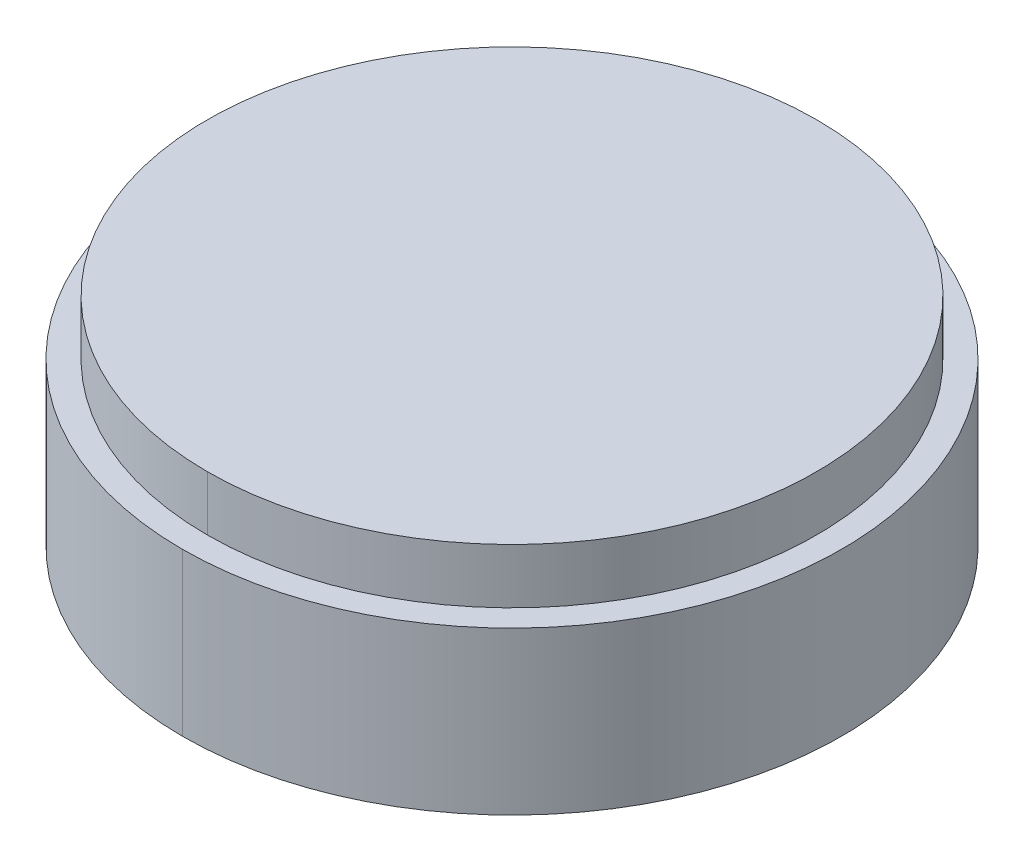
ISO-10303-21;
HEADER;
FILE_DESCRIPTION(('STEP AP214'),'2;1');
FILE_NAME('part.step','',(''),(''),'','','');
FILE_SCHEMA(('AUTOMOTIVE_DESIGN { 1 0 10303 214 1 1 1 1 }'));
ENDSEC;
DATA;
#1=APPLICATION_CONTEXT('core data for automotive mechanical design processes');
#2=APPLICATION_PROTOCOL_DEFINITION('international standard','automotive_design',2000,#1);
#3=PRODUCT_CONTEXT('',#1,'mechanical');
#4=PRODUCT('Part','Part','',(#3));
#5=PRODUCT_RELATED_PRODUCT_CATEGORY('part','',(#4));
#6=PRODUCT_DEFINITION_FORMATION('','',#4);
#7=PRODUCT_DEFINITION_CONTEXT('part definition',#1,'design');
#8=PRODUCT_DEFINITION('design','',#6,#7);
#9=PRODUCT_DEFINITION_SHAPE('','',#8);
#10=(LENGTH_UNIT() NAMED_UNIT(*) SI_UNIT(.MILLI.,.METRE.));
#11=(NAMED_UNIT(*) PLANE_ANGLE_UNIT() SI_UNIT($,.RADIAN.));
#12=(NAMED_UNIT(*) SI_UNIT($,.STERADIAN.) SOLID_ANGLE_UNIT());
#13=UNCERTAINTY_MEASURE_WITH_UNIT(LENGTH_MEASURE(1.E-05),#10,'distance_accuracy_value','');
#14=(GEOMETRIC_REPRESENTATION_CONTEXT(3) GLOBAL_UNCERTAINTY_ASSIGNED_CONTEXT((#13)) GLOBAL_UNIT_ASSIGNED_CONTEXT((#10,
#11,#12)) REPRESENTATION_CONTEXT('',''));
#15=CARTESIAN_POINT('',(0.,0.,0.));
#16=DIRECTION('',(0.,0.,1.));
#17=DIRECTION('',(1.,0.,0.));
#18=AXIS2_PLACEMENT_3D('',#15,#16,#17);
#19=CARTESIAN_POINT('',(0.,6.3,29.5));
#20=DIRECTION('',(0.,-1.,0.));
#21=DIRECTION('',(0.,0.,-1.));
#22=AXIS2_PLACEMENT_3D('',#19,#20,#21);
#23=CYLINDRICAL_SURFACE('',#22,1.5);
#24=CARTESIAN_POINT('',(0.,6.3,29.5));
#25=DIRECTION('',(0.,-1.,0.));
#26=DIRECTION('',(0.,0.,-1.));
#27=AXIS2_PLACEMENT_3D('',#24,#25,#26);
#28=CIRCLE('',#27,1.5);
#29=CARTESIAN_POINT('',(0.,6.3,31.));
#30=VERTEX_POINT('',#29);
#31=CARTESIAN_POINT('',(0.,6.3,28.));
#32=VERTEX_POINT('',#31);
#33=EDGE_CURVE('E39',#30,#32,#28,.T.);
#34=ORIENTED_EDGE('',*,*,#33,.F.);
#35=DIRECTION('',(0.,-1.,0.));
#36=VECTOR('',#35,1.);
#37=CARTESIAN_POINT('',(0.,6.3,31.));
#38=LINE('',#37,#36);
#39=CARTESIAN_POINT('',(0.,0.,31.));
#40=VERTEX_POINT('',#39);
#41=EDGE_CURVE('E10',#30,#40,#38,.T.);
#42=ORIENTED_EDGE('',*,*,#41,.T.);
#43=CARTESIAN_POINT('',(0.,0.,29.5));
#44=DIRECTION('',(0.,-1.,0.));
#45=DIRECTION('',(0.,0.,-1.));
#46=AXIS2_PLACEMENT_3D('',#43,#44,#45);
#47=CIRCLE('',#46,1.5);
#48=CARTESIAN_POINT('',(0.,0.,28.));
#49=VERTEX_POINT('',#48);
#50=EDGE_CURVE('E26',#40,#49,#47,.T.);
#51=ORIENTED_EDGE('',*,*,#50,.T.);
#52=DIRECTION('',(0.,-1.,0.));
#53=VECTOR('',#52,1.);
#54=CARTESIAN_POINT('',(0.,6.3,28.));
#55=LINE('',#54,#53);
#56=EDGE_CURVE('E156',#32,#49,#55,.T.);
#57=ORIENTED_EDGE('',*,*,#56,.F.);
#58=EDGE_LOOP('',(#34,#42,#51,#57));
#59=FACE_BOUND('',#58,.T.);
#60=ADVANCED_FACE('F15',(#59),#23,.F.);
#61=CARTESIAN_POINT('',(-20.8596500450019,6.3,-20.8596500450032));
#62=DIRECTION('',(0.,-1.,0.));
#63=DIRECTION('',(0.,0.,-1.));
#64=AXIS2_PLACEMENT_3D('',#61,#62,#63);
#65=CYLINDRICAL_SURFACE('',#64,1.50000000000062);
#66=CARTESIAN_POINT('',(-20.8596500450019,6.3,-20.8596500450032));
#67=DIRECTION('',(0.,-1.,0.));
#68=DIRECTION('',(0.,0.,-1.));
#69=AXIS2_PLACEMENT_3D('',#66,#67,#68);
#70=CIRCLE('',#69,1.50000000000062);
#71=CARTESIAN_POINT('',(-20.8596500450019,6.3,-19.3596500450025));
#72=VERTEX_POINT('',#71);
#73=CARTESIAN_POINT('',(-20.8596500450019,6.3,-22.3596500450038));
#74=VERTEX_POINT('',#73);
#75=EDGE_CURVE('E147',#72,#74,#70,.T.);
#76=ORIENTED_EDGE('',*,*,#75,.F.);
#77=DIRECTION('',(0.,-1.,0.));
#78=VECTOR('',#77,1.);
#79=CARTESIAN_POINT('',(-20.8596500450019,6.3,-19.3596500450025));
#80=LINE('',#79,#78);
#81=CARTESIAN_POINT('',(-20.8596500450019,0.,-19.3596500450025));
#82=VERTEX_POINT('',#81);
#83=EDGE_CURVE('E170',#72,#82,#80,.T.);
#84=ORIENTED_EDGE('',*,*,#83,.T.);
#85=CARTESIAN_POINT('',(-20.8596500450019,0.,-20.8596500450032));
#86=DIRECTION('',(0.,-1.,0.));
#87=DIRECTION('',(0.,0.,-1.));
#88=AXIS2_PLACEMENT_3D('',#85,#86,#87);
#89=CIRCLE('',#88,1.50000000000062);
#90=CARTESIAN_POINT('',(-20.8596500450019,0.,-22.3596500450038));
#91=VERTEX_POINT('',#90);
#92=EDGE_CURVE('E161',#82,#91,#89,.T.);
#93=ORIENTED_EDGE('',*,*,#92,.T.);
#94=DIRECTION('',(0.,-1.,0.));
#95=VECTOR('',#94,1.);
#96=CARTESIAN_POINT('',(-20.8596500450019,6.3,-22.3596500450038));
#97=LINE('',#96,#95);
#98=EDGE_CURVE('E159',#74,#91,#97,.T.);
#99=ORIENTED_EDGE('',*,*,#98,.F.);
#100=EDGE_LOOP('',(#76,#84,#93,#99));
#101=FACE_BOUND('',#100,.T.);
#102=ADVANCED_FACE('F160',(#101),#65,.F.);
#103=CARTESIAN_POINT('',(20.8596500450044,6.3,-20.8596500450019));
#104=DIRECTION('',(0.,-1.,0.));
#105=DIRECTION('',(0.,0.,-1.));
#106=AXIS2_PLACEMENT_3D('',#103,#104,#105);
#107=CYLINDRICAL_SURFACE('',#106,1.50000000000165);
#108=CARTESIAN_POINT('',(20.8596500450044,6.3,-20.8596500450019));
#109=DIRECTION('',(0.,-1.,0.));
#110=DIRECTION('',(0.,0.,-1.));
#111=AXIS2_PLACEMENT_3D('',#108,#109,#110);
#112=CIRCLE('',#111,1.50000000000165);
#113=CARTESIAN_POINT('',(20.8596500450044,6.3,-19.3596500450003));
#114=VERTEX_POINT('',#113);
#115=CARTESIAN_POINT('',(20.8596500450044,6.3,-22.3596500450036));
#116=VERTEX_POINT('',#115);
#117=EDGE_CURVE('E166',#114,#116,#112,.T.);
#118=ORIENTED_EDGE('',*,*,#117,.F.);
#119=DIRECTION('',(0.,-1.,0.));
#120=VECTOR('',#119,1.);
#121=CARTESIAN_POINT('',(20.8596500450044,6.3,-19.3596500450003));
#122=LINE('',#121,#120);
#123=CARTESIAN_POINT('',(20.8596500450044,0.,-19.3596500450003));
#124=VERTEX_POINT('',#123);
#125=EDGE_CURVE('E200',#114,#124,#122,.T.);
#126=ORIENTED_EDGE('',*,*,#125,.T.);
#127=CARTESIAN_POINT('',(20.8596500450044,0.,-20.8596500450019));
#128=DIRECTION('',(0.,-1.,0.));
#129=DIRECTION('',(0.,0.,-1.));
#130=AXIS2_PLACEMENT_3D('',#127,#128,#129);
#131=CIRCLE('',#130,1.50000000000165);
#132=CARTESIAN_POINT('',(20.8596500450044,0.,-22.3596500450036));
#133=VERTEX_POINT('',#132);
#134=EDGE_CURVE('E204',#124,#133,#131,.T.);
#135=ORIENTED_EDGE('',*,*,#134,.T.);
#136=DIRECTION('',(0.,-1.,0.));
#137=VECTOR('',#136,1.);
#138=CARTESIAN_POINT('',(20.8596500450044,6.3,-22.3596500450036));
#139=LINE('',#138,#137);
#140=EDGE_CURVE('E191',#116,#133,#139,.T.);
#141=ORIENTED_EDGE('',*,*,#140,.F.);
#142=EDGE_LOOP('',(#118,#126,#135,#141));
#143=FACE_BOUND('',#142,.T.);
#144=ADVANCED_FACE('F360',(#143),#107,.F.);
#145=CARTESIAN_POINT('',(20.8596500450031,6.3,20.8596500450044));
#146=DIRECTION('',(0.,-1.,0.));
#147=DIRECTION('',(0.,0.,-1.));
#148=AXIS2_PLACEMENT_3D('',#145,#146,#147);
#149=CYLINDRICAL_SURFACE('',#148,1.50000000000121);
#150=CARTESIAN_POINT('',(20.8596500450031,6.3,20.8596500450044));
#151=DIRECTION('',(0.,-1.,0.));
#152=DIRECTION('',(0.,0.,-1.));
#153=AXIS2_PLACEMENT_3D('',#150,#151,#152);
#154=CIRCLE('',#153,1.50000000000121);
#155=CARTESIAN_POINT('',(20.8596500450031,6.3,22.3596500450055));
#156=VERTEX_POINT('',#155);
#157=CARTESIAN_POINT('',(20.8596500450031,6.3,19.3596500450031));
#158=VERTEX_POINT('',#157);
#159=EDGE_CURVE('E187',#156,#158,#154,.T.);
#160=ORIENTED_EDGE('',*,*,#159,.F.);
#161=DIRECTION('',(0.,-1.,0.));
#162=VECTOR('',#161,1.);
#163=CARTESIAN_POINT('',(20.8596500450031,6.3,22.3596500450055));
#164=LINE('',#163,#162);
#165=CARTESIAN_POINT('',(20.8596500450031,0.,22.3596500450055));
#166=VERTEX_POINT('',#165);
#167=EDGE_CURVE('E213',#156,#166,#164,.T.);
#168=ORIENTED_EDGE('',*,*,#167,.T.);
#169=CARTESIAN_POINT('',(20.8596500450031,0.,20.8596500450044));
#170=DIRECTION('',(0.,-1.,0.));
#171=DIRECTION('',(0.,0.,-1.));
#172=AXIS2_PLACEMENT_3D('',#169,#170,#171);
#173=CIRCLE('',#172,1.50000000000121);
#174=CARTESIAN_POINT('',(20.8596500450031,0.,19.3596500450031));
#175=VERTEX_POINT('',#174);
#176=EDGE_CURVE('E19',#166,#175,#173,.T.);
#177=ORIENTED_EDGE('',*,*,#176,.T.);
#178=DIRECTION('',(0.,-1.,0.));
#179=VECTOR('',#178,1.);
#180=CARTESIAN_POINT('',(20.8596500450031,6.3,19.3596500450031));
#181=LINE('',#180,#179);
#182=EDGE_CURVE('E217',#158,#175,#181,.T.);
#183=ORIENTED_EDGE('',*,*,#182,.F.);
#184=EDGE_LOOP('',(#160,#168,#177,#183));
#185=FACE_BOUND('',#184,.T.);
#186=ADVANCED_FACE('F552',(#185),#149,.F.);
#187=CARTESIAN_POINT('',(-20.8596500450032,6.3,20.8596500450031));
#188=DIRECTION('',(0.,-1.,0.));
#189=DIRECTION('',(0.,0.,-1.));
#190=AXIS2_PLACEMENT_3D('',#187,#188,#189);
#191=CYLINDRICAL_SURFACE('',#190,1.5);
#192=CARTESIAN_POINT('',(-20.8596500450032,6.3,20.8596500450031));
#193=DIRECTION('',(0.,-1.,0.));
#194=DIRECTION('',(0.,0.,-1.));
#195=AXIS2_PLACEMENT_3D('',#192,#193,#194);
#196=CIRCLE('',#195,1.5);
#197=CARTESIAN_POINT('',(-20.8596500450032,6.3,22.3596500450031));
#198=VERTEX_POINT('',#197);
#199=CARTESIAN_POINT('',(-20.8596500450032,6.3,19.3596500450031));
#200=VERTEX_POINT('',#199);
#201=EDGE_CURVE('E220',#198,#200,#196,.T.);
#202=ORIENTED_EDGE('',*,*,#201,.F.);
#203=DIRECTION('',(0.,-1.,0.));
#204=VECTOR('',#203,1.);
#205=CARTESIAN_POINT('',(-20.8596500450032,6.3,22.3596500450031));
#206=LINE('',#205,#204);
#207=CARTESIAN_POINT('',(-20.8596500450032,0.,22.3596500450031));
#208=VERTEX_POINT('',#207);
#209=EDGE_CURVE('E198',#198,#208,#206,.T.);
#210=ORIENTED_EDGE('',*,*,#209,.T.);
#211=CARTESIAN_POINT('',(-20.8596500450032,0.,20.8596500450031));
#212=DIRECTION('',(0.,-1.,0.));
#213=DIRECTION('',(0.,0.,-1.));
#214=AXIS2_PLACEMENT_3D('',#211,#212,#213);
#215=CIRCLE('',#214,1.5);
#216=CARTESIAN_POINT('',(-20.8596500450032,0.,19.3596500450031));
#217=VERTEX_POINT('',#216);
#218=EDGE_CURVE('E194',#208,#217,#215,.T.);
#219=ORIENTED_EDGE('',*,*,#218,.T.);
#220=DIRECTION('',(0.,-1.,0.));
#221=VECTOR('',#220,1.);
#222=CARTESIAN_POINT('',(-20.8596500450032,6.3,19.3596500450031));
#223=LINE('',#222,#221);
#224=EDGE_CURVE('E205',#200,#217,#223,.T.);
#225=ORIENTED_EDGE('',*,*,#224,.F.);
#226=EDGE_LOOP('',(#202,#210,#219,#225));
#227=FACE_BOUND('',#226,.T.);
#228=ADVANCED_FACE('F341',(#227),#191,.F.);
#229=CARTESIAN_POINT('',(0.,24.9,0.));
#230=DIRECTION('',(0.,-1.,0.));
#231=DIRECTION('',(0.,0.,-1.));
#232=AXIS2_PLACEMENT_3D('',#229,#230,#231);
#233=CYLINDRICAL_SURFACE('',#232,35.);
#234=CARTESIAN_POINT('',(0.,24.9,0.));
#235=DIRECTION('',(0.,1.,0.));
#236=DIRECTION('',(0.,0.,1.));
#237=AXIS2_PLACEMENT_3D('',#234,#235,#236);
#238=CIRCLE('',#237,35.);
#239=CARTESIAN_POINT('',(0.,24.9,35.));
#240=VERTEX_POINT('',#239);
#241=CARTESIAN_POINT('',(0.,24.9,-35.));
#242=VERTEX_POINT('',#241);
#243=EDGE_CURVE('E208',#240,#242,#238,.T.);
#244=ORIENTED_EDGE('',*,*,#243,.F.);
#245=DIRECTION('',(0.,-1.,0.));
#246=VECTOR('',#245,1.);
#247=CARTESIAN_POINT('',(0.,24.9,35.));
#248=LINE('',#247,#246);
#249=CARTESIAN_POINT('',(0.,18.6,35.));
#250=VERTEX_POINT('',#249);
#251=EDGE_CURVE('E199',#240,#250,#248,.T.);
#252=ORIENTED_EDGE('',*,*,#251,.T.);
#253=CARTESIAN_POINT('',(0.,18.6,0.));
#254=DIRECTION('',(0.,1.,0.));
#255=DIRECTION('',(0.,0.,1.));
#256=AXIS2_PLACEMENT_3D('',#253,#254,#255);
#257=CIRCLE('',#256,35.);
#258=CARTESIAN_POINT('',(0.,18.6,-35.));
#259=VERTEX_POINT('',#258);
#260=EDGE_CURVE('E233',#250,#259,#257,.T.);
#261=ORIENTED_EDGE('',*,*,#260,.T.);
#262=DIRECTION('',(0.,-1.,0.));
#263=VECTOR('',#262,1.);
#264=CARTESIAN_POINT('',(0.,24.9,-35.));
#265=LINE('',#264,#263);
#266=EDGE_CURVE('E238',#242,#259,#265,.T.);
#267=ORIENTED_EDGE('',*,*,#266,.F.);
#268=EDGE_LOOP('',(#244,#252,#261,#267));
#269=FACE_BOUND('',#268,.T.);
#270=ADVANCED_FACE('F498',(#269),#233,.T.);
#271=CARTESIAN_POINT('',(0.,18.6,0.));
#272=DIRECTION('',(0.,-1.,0.));
#273=DIRECTION('',(0.,0.,-1.));
#274=AXIS2_PLACEMENT_3D('',#271,#272,#273);
#275=CYLINDRICAL_SURFACE('',#274,37.85);
#276=CARTESIAN_POINT('',(0.,18.6,0.));
#277=DIRECTION('',(0.,1.,0.));
#278=DIRECTION('',(0.,0.,1.));
#279=AXIS2_PLACEMENT_3D('',#276,#277,#278);
#280=CIRCLE('',#279,37.85);
#281=CARTESIAN_POINT('',(0.,18.6,37.85));
#282=VERTEX_POINT('',#281);
#283=CARTESIAN_POINT('',(0.,18.6,-37.85));
#284=VERTEX_POINT('',#283);
#285=EDGE_CURVE('E241',#282,#284,#280,.T.);
#286=ORIENTED_EDGE('',*,*,#285,.F.);
#287=DIRECTION('',(0.,-1.,0.));
#288=VECTOR('',#287,1.);
#289=CARTESIAN_POINT('',(0.,18.6,37.85));
#290=LINE('',#289,#288);
#291=CARTESIAN_POINT('',(0.,0.,37.85));
#292=VERTEX_POINT('',#291);
#293=EDGE_CURVE('E237',#282,#292,#290,.T.);
#294=ORIENTED_EDGE('',*,*,#293,.T.);
#295=CARTESIAN_POINT('',(0.,0.,0.));
#296=DIRECTION('',(0.,1.,0.));
#297=DIRECTION('',(0.,0.,1.));
#298=AXIS2_PLACEMENT_3D('',#295,#296,#297);
#299=CIRCLE('',#298,37.85);
#300=CARTESIAN_POINT('',(0.,0.,-37.85));
#301=VERTEX_POINT('',#300);
#302=EDGE_CURVE('E248',#292,#301,#299,.T.);
#303=ORIENTED_EDGE('',*,*,#302,.T.);
#304=DIRECTION('',(0.,-1.,0.));
#305=VECTOR('',#304,1.);
#306=CARTESIAN_POINT('',(0.,18.6,-37.85));
#307=LINE('',#306,#305);
#308=EDGE_CURVE('E185',#284,#301,#307,.T.);
#309=ORIENTED_EDGE('',*,*,#308,.F.);
#310=EDGE_LOOP('',(#286,#294,#303,#309));
#311=FACE_BOUND('',#310,.T.);
#312=ADVANCED_FACE('F324',(#311),#275,.T.);
#313=CARTESIAN_POINT('',(0.,18.6,0.));
#314=DIRECTION('',(0.,-1.,0.));
#315=DIRECTION('',(0.,0.,-1.));
#316=AXIS2_PLACEMENT_3D('',#313,#314,#315);
#317=CYLINDRICAL_SURFACE('',#316,37.85);
#318=ORIENTED_EDGE('',*,*,#293,.F.);
#319=CARTESIAN_POINT('',(0.,18.6,0.));
#320=DIRECTION('',(0.,1.,0.));
#321=DIRECTION('',(0.,0.,1.));
#322=AXIS2_PLACEMENT_3D('',#319,#320,#321);
#323=CIRCLE('',#322,37.85);
#324=EDGE_CURVE('E186',#284,#282,#323,.T.);
#325=ORIENTED_EDGE('',*,*,#324,.F.);
#326=ORIENTED_EDGE('',*,*,#308,.T.);
#327=CARTESIAN_POINT('',(0.,0.,0.));
#328=DIRECTION('',(0.,1.,0.));
#329=DIRECTION('',(0.,0.,1.));
#330=AXIS2_PLACEMENT_3D('',#327,#328,#329);
#331=CIRCLE('',#330,37.85);
#332=EDGE_CURVE('E182',#301,#292,#331,.T.);
#333=ORIENTED_EDGE('',*,*,#332,.T.);
#334=EDGE_LOOP('',(#318,#325,#326,#333));
#335=FACE_BOUND('',#334,.T.);
#336=ADVANCED_FACE('F321',(#335),#317,.T.);
#337=CARTESIAN_POINT('',(0.,18.6,0.));
#338=DIRECTION('',(0.,1.,0.));
#339=DIRECTION('',(1.,0.,0.));
#340=AXIS2_PLACEMENT_3D('',#337,#338,#339);
#341=PLANE('',#340);
#342=ORIENTED_EDGE('',*,*,#324,.T.);
#343=ORIENTED_EDGE('',*,*,#285,.T.);
#344=EDGE_LOOP('',(#342,#343));
#345=FACE_BOUND('',#344,.T.);
#346=CARTESIAN_POINT('',(0.,18.6,0.));
#347=DIRECTION('',(0.,1.,0.));
#348=DIRECTION('',(0.,0.,1.));
#349=AXIS2_PLACEMENT_3D('',#346,#347,#348);
#350=CIRCLE('',#349,35.);
#351=EDGE_CURVE('E242',#259,#250,#350,.T.);
#352=ORIENTED_EDGE('',*,*,#351,.F.);
#353=ORIENTED_EDGE('',*,*,#260,.F.);
#354=EDGE_LOOP('',(#352,#353));
#355=FACE_BOUND('',#354,.T.);
#356=ADVANCED_FACE('F330',(#345,#355),#341,.T.);
#357=CARTESIAN_POINT('',(0.,0.,0.));
#358=DIRECTION('',(0.,1.,0.));
#359=DIRECTION('',(1.,0.,0.));
#360=AXIS2_PLACEMENT_3D('',#357,#358,#359);
#361=PLANE('',#360);
#362=ORIENTED_EDGE('',*,*,#332,.F.);
#363=ORIENTED_EDGE('',*,*,#302,.F.);
#364=EDGE_LOOP('',(#362,#363));
#365=FACE_BOUND('',#364,.T.);
#366=CARTESIAN_POINT('',(0.,0.,29.5));
#367=DIRECTION('',(0.,-1.,0.));
#368=DIRECTION('',(0.,0.,-1.));
#369=AXIS2_PLACEMENT_3D('',#366,#367,#368);
#370=CIRCLE('',#369,1.5);
#371=EDGE_CURVE('E249',#49,#40,#370,.T.);
#372=ORIENTED_EDGE('',*,*,#371,.F.);
#373=ORIENTED_EDGE('',*,*,#50,.F.);
#374=EDGE_LOOP('',(#372,#373));
#375=FACE_BOUND('',#374,.T.);
#376=CARTESIAN_POINT('',(-20.8596500450019,0.,-20.8596500450032));
#377=DIRECTION('',(0.,-1.,0.));
#378=DIRECTION('',(0.,0.,-1.));
#379=AXIS2_PLACEMENT_3D('',#376,#377,#378);
#380=CIRCLE('',#379,1.50000000000062);
#381=EDGE_CURVE('E167',#91,#82,#380,.T.);
#382=ORIENTED_EDGE('',*,*,#381,.F.);
#383=ORIENTED_EDGE('',*,*,#92,.F.);
#384=EDGE_LOOP('',(#382,#383));
#385=FACE_BOUND('',#384,.T.);
#386=CARTESIAN_POINT('',(20.8596500450044,0.,-20.8596500450019));
#387=DIRECTION('',(0.,-1.,0.));
#388=DIRECTION('',(0.,0.,-1.));
#389=AXIS2_PLACEMENT_3D('',#386,#387,#388);
#390=CIRCLE('',#389,1.50000000000165);
#391=EDGE_CURVE('E297',#133,#124,#390,.T.);
#392=ORIENTED_EDGE('',*,*,#391,.F.);
#393=ORIENTED_EDGE('',*,*,#134,.F.);
#394=EDGE_LOOP('',(#392,#393));
#395=FACE_BOUND('',#394,.T.);
#396=CARTESIAN_POINT('',(20.8596500450031,0.,20.8596500450044));
#397=DIRECTION('',(0.,-1.,0.));
#398=DIRECTION('',(0.,0.,-1.));
#399=AXIS2_PLACEMENT_3D('',#396,#397,#398);
#400=CIRCLE('',#399,1.50000000000121);
#401=EDGE_CURVE('E180',#175,#166,#400,.T.);
#402=ORIENTED_EDGE('',*,*,#401,.F.);
#403=ORIENTED_EDGE('',*,*,#176,.F.);
#404=EDGE_LOOP('',(#402,#403));
#405=FACE_BOUND('',#404,.T.);
#406=CARTESIAN_POINT('',(-20.8596500450032,0.,20.8596500450031));
#407=DIRECTION('',(0.,-1.,0.));
#408=DIRECTION('',(0.,0.,-1.));
#409=AXIS2_PLACEMENT_3D('',#406,#407,#408);
#410=CIRCLE('',#409,1.5);
#411=EDGE_CURVE('E209',#217,#208,#410,.T.);
#412=ORIENTED_EDGE('',*,*,#411,.F.);
#413=ORIENTED_EDGE('',*,*,#218,.F.);
#414=EDGE_LOOP('',(#412,#413));
#415=FACE_BOUND('',#414,.T.);
#416=ADVANCED_FACE('F326',(#365,#375,#385,#395,#405,#415),#361,.F.);
#417=CARTESIAN_POINT('',(0.,24.9,0.));
#418=DIRECTION('',(0.,-1.,0.));
#419=DIRECTION('',(0.,0.,-1.));
#420=AXIS2_PLACEMENT_3D('',#417,#418,#419);
#421=CYLINDRICAL_SURFACE('',#420,35.);
#422=ORIENTED_EDGE('',*,*,#251,.F.);
#423=CARTESIAN_POINT('',(0.,24.9,0.));
#424=DIRECTION('',(0.,1.,0.));
#425=DIRECTION('',(0.,0.,1.));
#426=AXIS2_PLACEMENT_3D('',#423,#424,#425);
#427=CIRCLE('',#426,35.);
#428=EDGE_CURVE('E226',#242,#240,#427,.T.);
#429=ORIENTED_EDGE('',*,*,#428,.F.);
#430=ORIENTED_EDGE('',*,*,#266,.T.);
#431=ORIENTED_EDGE('',*,*,#351,.T.);
#432=EDGE_LOOP('',(#422,#429,#430,#431));
#433=FACE_BOUND('',#432,.T.);
#434=ADVANCED_FACE('F329',(#433),#421,.T.);
#435=CARTESIAN_POINT('',(0.,24.9,0.));
#436=DIRECTION('',(0.,1.,0.));
#437=DIRECTION('',(1.,0.,0.));
#438=AXIS2_PLACEMENT_3D('',#435,#436,#437);
#439=PLANE('',#438);
#440=ORIENTED_EDGE('',*,*,#428,.T.);
#441=ORIENTED_EDGE('',*,*,#243,.T.);
#442=EDGE_LOOP('',(#440,#441));
#443=FACE_BOUND('',#442,.T.);
#444=ADVANCED_FACE('F17',(#443),#439,.T.);
#445=CARTESIAN_POINT('',(-20.8596500450032,6.3,20.8596500450031));
#446=DIRECTION('',(0.,-1.,0.));
#447=DIRECTION('',(0.,0.,-1.));
#448=AXIS2_PLACEMENT_3D('',#445,#446,#447);
#449=CYLINDRICAL_SURFACE('',#448,1.5);
#450=ORIENTED_EDGE('',*,*,#209,.F.);
#451=CARTESIAN_POINT('',(-20.8596500450032,6.3,20.8596500450031));
#452=DIRECTION('',(0.,-1.,0.));
#453=DIRECTION('',(0.,0.,-1.));
#454=AXIS2_PLACEMENT_3D('',#451,#452,#453);
#455=CIRCLE('',#454,1.5);
#456=EDGE_CURVE('E274',#200,#198,#455,.T.);
#457=ORIENTED_EDGE('',*,*,#456,.F.);
#458=ORIENTED_EDGE('',*,*,#224,.T.);
#459=ORIENTED_EDGE('',*,*,#411,.T.);
#460=EDGE_LOOP('',(#450,#457,#458,#459));
#461=FACE_BOUND('',#460,.T.);
#462=ADVANCED_FACE('F342',(#461),#449,.F.);
#463=CARTESIAN_POINT('',(-20.8596500450032,6.3,20.8596500450031));
#464=DIRECTION('',(0.,-1.,0.));
#465=DIRECTION('',(0.,0.,-1.));
#466=AXIS2_PLACEMENT_3D('',#463,#464,#465);
#467=PLANE('',#466);
#468=ORIENTED_EDGE('',*,*,#456,.T.);
#469=ORIENTED_EDGE('',*,*,#201,.T.);
#470=EDGE_LOOP('',(#468,#469));
#471=FACE_BOUND('',#470,.T.);
#472=ADVANCED_FACE('F344',(#471),#467,.T.);
#473=CARTESIAN_POINT('',(20.8596500450031,6.3,20.8596500450044));
#474=DIRECTION('',(0.,-1.,0.));
#475=DIRECTION('',(0.,0.,-1.));
#476=AXIS2_PLACEMENT_3D('',#473,#474,#475);
#477=CYLINDRICAL_SURFACE('',#476,1.50000000000121);
#478=ORIENTED_EDGE('',*,*,#167,.F.);
#479=CARTESIAN_POINT('',(20.8596500450031,6.3,20.8596500450044));
#480=DIRECTION('',(0.,-1.,0.));
#481=DIRECTION('',(0.,0.,-1.));
#482=AXIS2_PLACEMENT_3D('',#479,#480,#481);
#483=CIRCLE('',#482,1.50000000000121);
#484=EDGE_CURVE('E190',#158,#156,#483,.T.);
#485=ORIENTED_EDGE('',*,*,#484,.F.);
#486=ORIENTED_EDGE('',*,*,#182,.T.);
#487=ORIENTED_EDGE('',*,*,#401,.T.);
#488=EDGE_LOOP('',(#478,#485,#486,#487));
#489=FACE_BOUND('',#488,.T.);
#490=ADVANCED_FACE('F351',(#489),#477,.F.);
#491=CARTESIAN_POINT('',(20.8596500450031,6.3,20.8596500450044));
#492=DIRECTION('',(0.,-1.,0.));
#493=DIRECTION('',(0.,0.,-1.));
#494=AXIS2_PLACEMENT_3D('',#491,#492,#493);
#495=PLANE('',#494);
#496=ORIENTED_EDGE('',*,*,#484,.T.);
#497=ORIENTED_EDGE('',*,*,#159,.T.);
#498=EDGE_LOOP('',(#496,#497));
#499=FACE_BOUND('',#498,.T.);
#500=ADVANCED_FACE('F519',(#499),#495,.T.);
#501=CARTESIAN_POINT('',(20.8596500450044,6.3,-20.8596500450019));
#502=DIRECTION('',(0.,-1.,0.));
#503=DIRECTION('',(0.,0.,-1.));
#504=AXIS2_PLACEMENT_3D('',#501,#502,#503);
#505=CYLINDRICAL_SURFACE('',#504,1.50000000000165);
#506=ORIENTED_EDGE('',*,*,#125,.F.);
#507=CARTESIAN_POINT('',(20.8596500450044,6.3,-20.8596500450019));
#508=DIRECTION('',(0.,-1.,0.));
#509=DIRECTION('',(0.,0.,-1.));
#510=AXIS2_PLACEMENT_3D('',#507,#508,#509);
#511=CIRCLE('',#510,1.50000000000165);
#512=EDGE_CURVE('E212',#116,#114,#511,.T.);
#513=ORIENTED_EDGE('',*,*,#512,.F.);
#514=ORIENTED_EDGE('',*,*,#140,.T.);
#515=ORIENTED_EDGE('',*,*,#391,.T.);
#516=EDGE_LOOP('',(#506,#513,#514,#515));
#517=FACE_BOUND('',#516,.T.);
#518=ADVANCED_FACE('F560',(#517),#505,.F.);
#519=CARTESIAN_POINT('',(20.8596500450044,6.3,-20.8596500450019));
#520=DIRECTION('',(0.,-1.,0.));
#521=DIRECTION('',(0.,0.,-1.));
#522=AXIS2_PLACEMENT_3D('',#519,#520,#521);
#523=PLANE('',#522);
#524=ORIENTED_EDGE('',*,*,#512,.T.);
#525=ORIENTED_EDGE('',*,*,#117,.T.);
#526=EDGE_LOOP('',(#524,#525));
#527=FACE_BOUND('',#526,.T.);
#528=ADVANCED_FACE('F556',(#527),#523,.T.);
#529=CARTESIAN_POINT('',(-20.8596500450019,6.3,-20.8596500450032));
#530=DIRECTION('',(0.,-1.,0.));
#531=DIRECTION('',(0.,0.,-1.));
#532=AXIS2_PLACEMENT_3D('',#529,#530,#531);
#533=CYLINDRICAL_SURFACE('',#532,1.50000000000062);
#534=ORIENTED_EDGE('',*,*,#83,.F.);
#535=CARTESIAN_POINT('',(-20.8596500450019,6.3,-20.8596500450032));
#536=DIRECTION('',(0.,-1.,0.));
#537=DIRECTION('',(0.,0.,-1.));
#538=AXIS2_PLACEMENT_3D('',#535,#536,#537);
#539=CIRCLE('',#538,1.50000000000062);
#540=EDGE_CURVE('E151',#74,#72,#539,.T.);
#541=ORIENTED_EDGE('',*,*,#540,.F.);
#542=ORIENTED_EDGE('',*,*,#98,.T.);
#543=ORIENTED_EDGE('',*,*,#381,.T.);
#544=EDGE_LOOP('',(#534,#541,#542,#543));
#545=FACE_BOUND('',#544,.T.);
#546=ADVANCED_FACE('F169',(#545),#533,.F.);
#547=CARTESIAN_POINT('',(-20.8596500450019,6.3,-20.8596500450032));
#548=DIRECTION('',(0.,-1.,0.));
#549=DIRECTION('',(0.,0.,-1.));
#550=AXIS2_PLACEMENT_3D('',#547,#548,#549);
#551=PLANE('',#550);
#552=ORIENTED_EDGE('',*,*,#540,.T.);
#553=ORIENTED_EDGE('',*,*,#75,.T.);
#554=EDGE_LOOP('',(#552,#553));
#555=FACE_BOUND('',#554,.T.);
#556=ADVANCED_FACE('F149',(#555),#551,.T.);
#557=CARTESIAN_POINT('',(0.,6.3,29.5));
#558=DIRECTION('',(0.,-1.,0.));
#559=DIRECTION('',(0.,0.,-1.));
#560=AXIS2_PLACEMENT_3D('',#557,#558,#559);
#561=CYLINDRICAL_SURFACE('',#560,1.5);
#562=ORIENTED_EDGE('',*,*,#41,.F.);
#563=CARTESIAN_POINT('',(0.,6.3,29.5));
#564=DIRECTION('',(0.,-1.,0.));
#565=DIRECTION('',(0.,0.,-1.));
#566=AXIS2_PLACEMENT_3D('',#563,#564,#565);
#567=CIRCLE('',#566,1.5);
#568=EDGE_CURVE('E229',#32,#30,#567,.T.);
#569=ORIENTED_EDGE('',*,*,#568,.F.);
#570=ORIENTED_EDGE('',*,*,#56,.T.);
#571=ORIENTED_EDGE('',*,*,#371,.T.);
#572=EDGE_LOOP('',(#562,#569,#570,#571));
#573=FACE_BOUND('',#572,.T.);
#574=ADVANCED_FACE('F507',(#573),#561,.F.);
#575=CARTESIAN_POINT('',(0.,6.3,29.5));
#576=DIRECTION('',(0.,-1.,0.));
#577=DIRECTION('',(0.,0.,-1.));
#578=AXIS2_PLACEMENT_3D('',#575,#576,#577);
#579=PLANE('',#578);
#580=ORIENTED_EDGE('',*,*,#568,.T.);
#581=ORIENTED_EDGE('',*,*,#33,.T.);
#582=EDGE_LOOP('',(#580,#581));
#583=FACE_BOUND('',#582,.T.);
#584=ADVANCED_FACE('F511',(#583),#579,.T.);
#585=CLOSED_SHELL('',(#60,#102,#144,#186,#228,#270,#312,#336,#356,#416,#434,#444,#462,#472,#490,
#500,#518,#528,#546,#556,#574,#584));
#586=MANIFOLD_SOLID_BREP('B1',#585);
#587=ADVANCED_BREP_SHAPE_REPRESENTATION('',(#18,#586),#14);
#588=SHAPE_DEFINITION_REPRESENTATION(#9,#587);
ENDSEC;
END-ISO-10303-21;
